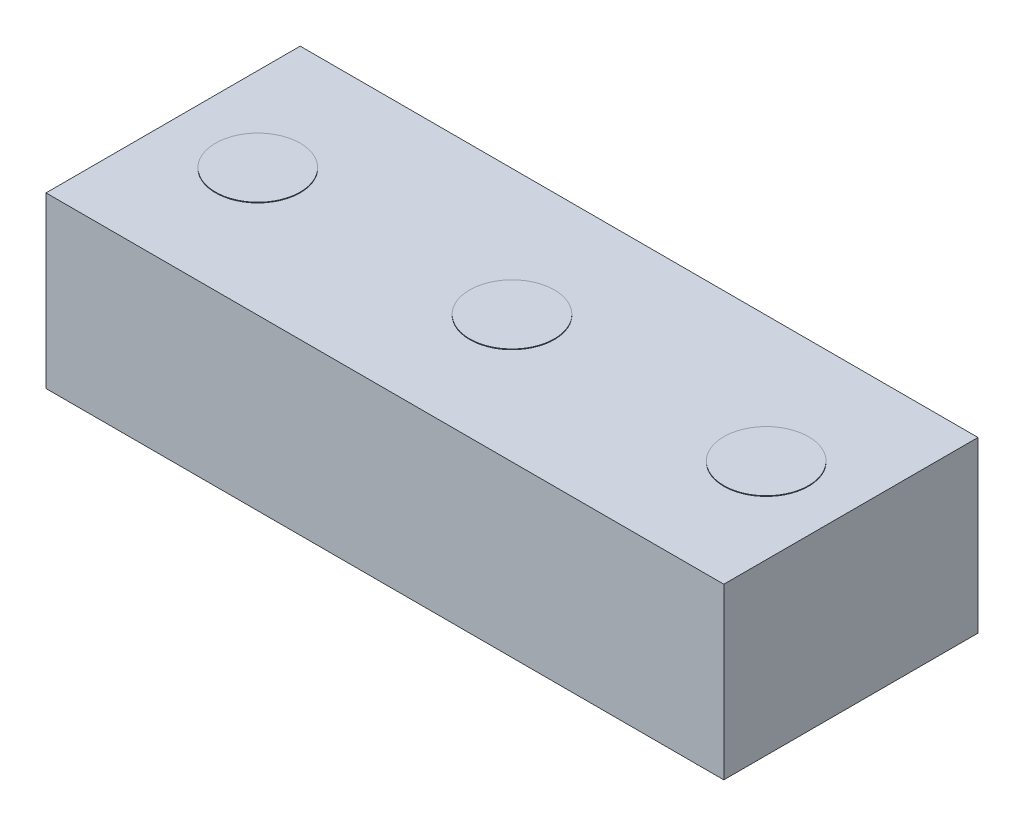
ISO-10303-21;
HEADER;
FILE_DESCRIPTION(('STEP AP214'),'2;1');
FILE_NAME('part.step','',(''),(''),'','','');
FILE_SCHEMA(('AUTOMOTIVE_DESIGN { 1 0 10303 214 1 1 1 1 }'));
ENDSEC;
DATA;
#1=APPLICATION_CONTEXT('core data for automotive mechanical design processes');
#2=APPLICATION_PROTOCOL_DEFINITION('international standard','automotive_design',2000,#1);
#3=PRODUCT_CONTEXT('',#1,'mechanical');
#4=PRODUCT('Part','Part','',(#3));
#5=PRODUCT_RELATED_PRODUCT_CATEGORY('part','',(#4));
#6=PRODUCT_DEFINITION_FORMATION('','',#4);
#7=PRODUCT_DEFINITION_CONTEXT('part definition',#1,'design');
#8=PRODUCT_DEFINITION('design','',#6,#7);
#9=PRODUCT_DEFINITION_SHAPE('','',#8);
#10=(LENGTH_UNIT() NAMED_UNIT(*) SI_UNIT(.MILLI.,.METRE.));
#11=(NAMED_UNIT(*) PLANE_ANGLE_UNIT() SI_UNIT($,.RADIAN.));
#12=(NAMED_UNIT(*) SI_UNIT($,.STERADIAN.) SOLID_ANGLE_UNIT());
#13=UNCERTAINTY_MEASURE_WITH_UNIT(LENGTH_MEASURE(1.E-05),#10,'distance_accuracy_value','');
#14=(GEOMETRIC_REPRESENTATION_CONTEXT(3) GLOBAL_UNCERTAINTY_ASSIGNED_CONTEXT((#13)) GLOBAL_UNIT_ASSIGNED_CONTEXT((#10,
#11,#12)) REPRESENTATION_CONTEXT('',''));
#15=CARTESIAN_POINT('',(0.,0.,0.));
#16=DIRECTION('',(0.,0.,1.));
#17=DIRECTION('',(1.,0.,0.));
#18=AXIS2_PLACEMENT_3D('',#15,#16,#17);
#19=CARTESIAN_POINT('',(150.,100.4,0.));
#20=DIRECTION('',(0.,-1.,0.));
#21=DIRECTION('',(0.,0.,-1.));
#22=AXIS2_PLACEMENT_3D('',#19,#20,#21);
#23=CYLINDRICAL_SURFACE('',#22,25.);
#24=CARTESIAN_POINT('',(150.,100.4,0.));
#25=DIRECTION('',(0.,1.,0.));
#26=DIRECTION('',(0.,0.,1.));
#27=AXIS2_PLACEMENT_3D('',#24,#25,#26);
#28=CIRCLE('',#27,25.);
#29=CARTESIAN_POINT('',(150.,100.4,25.));
#30=VERTEX_POINT('',#29);
#31=EDGE_CURVE('E90',#30,#30,#28,.T.);
#32=ORIENTED_EDGE('',*,*,#31,.F.);
#33=EDGE_LOOP('',(#32));
#34=FACE_BOUND('',#33,.T.);
#35=CARTESIAN_POINT('',(150.,100.,0.));
#36=DIRECTION('',(0.,1.,0.));
#37=DIRECTION('',(0.,0.,1.));
#38=AXIS2_PLACEMENT_3D('',#35,#36,#37);
#39=CIRCLE('',#38,25.);
#40=CARTESIAN_POINT('',(150.,100.,25.));
#41=VERTEX_POINT('',#40);
#42=EDGE_CURVE('E12',#41,#41,#39,.T.);
#43=ORIENTED_EDGE('',*,*,#42,.T.);
#44=EDGE_LOOP('',(#43));
#45=FACE_BOUND('',#44,.T.);
#46=ADVANCED_FACE('F86',(#34,#45),#23,.T.);
#47=CARTESIAN_POINT('',(150.,100.4,0.));
#48=DIRECTION('',(0.,1.,0.));
#49=DIRECTION('',(0.,0.,1.));
#50=AXIS2_PLACEMENT_3D('',#47,#48,#49);
#51=PLANE('',#50);
#52=ORIENTED_EDGE('',*,*,#31,.T.);
#53=EDGE_LOOP('',(#52));
#54=FACE_BOUND('',#53,.T.);
#55=ADVANCED_FACE('F88',(#54),#51,.T.);
#56=CARTESIAN_POINT('',(150.,100.,0.));
#57=DIRECTION('',(0.,1.,0.));
#58=DIRECTION('',(0.,0.,1.));
#59=AXIS2_PLACEMENT_3D('',#56,#57,#58);
#60=PLANE('',#59);
#61=ORIENTED_EDGE('',*,*,#42,.F.);
#62=EDGE_LOOP('',(#61));
#63=FACE_BOUND('',#62,.T.);
#64=ADVANCED_FACE('F106',(#63),#60,.F.);
#65=CLOSED_SHELL('',(#46,#55,#64));
#66=MANIFOLD_SOLID_BREP('B2',#65);
#67=CARTESIAN_POINT('',(-150.,100.4,0.));
#68=DIRECTION('',(0.,-1.,0.));
#69=DIRECTION('',(0.,0.,-1.));
#70=AXIS2_PLACEMENT_3D('',#67,#68,#69);
#71=CYLINDRICAL_SURFACE('',#70,25.);
#72=CARTESIAN_POINT('',(-150.,100.4,0.));
#73=DIRECTION('',(0.,1.,0.));
#74=DIRECTION('',(0.,0.,-1.));
#75=AXIS2_PLACEMENT_3D('',#72,#73,#74);
#76=CIRCLE('',#75,25.);
#77=CARTESIAN_POINT('',(-150.,100.4,-25.));
#78=VERTEX_POINT('',#77);
#79=EDGE_CURVE('E144',#78,#78,#76,.T.);
#80=ORIENTED_EDGE('',*,*,#79,.F.);
#81=EDGE_LOOP('',(#80));
#82=FACE_BOUND('',#81,.T.);
#83=CARTESIAN_POINT('',(-150.,100.,0.));
#84=DIRECTION('',(0.,1.,0.));
#85=DIRECTION('',(0.,0.,-1.));
#86=AXIS2_PLACEMENT_3D('',#83,#84,#85);
#87=CIRCLE('',#86,25.);
#88=CARTESIAN_POINT('',(-150.,100.,-25.));
#89=VERTEX_POINT('',#88);
#90=EDGE_CURVE('E85',#89,#89,#87,.T.);
#91=ORIENTED_EDGE('',*,*,#90,.T.);
#92=EDGE_LOOP('',(#91));
#93=FACE_BOUND('',#92,.T.);
#94=ADVANCED_FACE('F140',(#82,#93),#71,.T.);
#95=CARTESIAN_POINT('',(-150.,100.4,0.));
#96=DIRECTION('',(0.,-1.,0.));
#97=DIRECTION('',(0.,0.,-1.));
#98=AXIS2_PLACEMENT_3D('',#95,#96,#97);
#99=PLANE('',#98);
#100=ORIENTED_EDGE('',*,*,#79,.T.);
#101=EDGE_LOOP('',(#100));
#102=FACE_BOUND('',#101,.T.);
#103=ADVANCED_FACE('F142',(#102),#99,.F.);
#104=CARTESIAN_POINT('',(-150.,100.,0.));
#105=DIRECTION('',(0.,-1.,0.));
#106=DIRECTION('',(0.,0.,-1.));
#107=AXIS2_PLACEMENT_3D('',#104,#105,#106);
#108=PLANE('',#107);
#109=ORIENTED_EDGE('',*,*,#90,.F.);
#110=EDGE_LOOP('',(#109));
#111=FACE_BOUND('',#110,.T.);
#112=ADVANCED_FACE('F160',(#111),#108,.T.);
#113=CLOSED_SHELL('',(#94,#103,#112));
#114=MANIFOLD_SOLID_BREP('B7',#113);
#115=CARTESIAN_POINT('',(0.,100.4,0.));
#116=DIRECTION('',(0.,-1.,0.));
#117=DIRECTION('',(0.,0.,-1.));
#118=AXIS2_PLACEMENT_3D('',#115,#116,#117);
#119=CYLINDRICAL_SURFACE('',#118,25.);
#120=CARTESIAN_POINT('',(0.,100.4,0.));
#121=DIRECTION('',(0.,1.,0.));
#122=DIRECTION('',(0.,0.,1.));
#123=AXIS2_PLACEMENT_3D('',#120,#121,#122);
#124=CIRCLE('',#123,25.);
#125=CARTESIAN_POINT('',(0.,100.4,25.));
#126=VERTEX_POINT('',#125);
#127=EDGE_CURVE('E139',#126,#126,#124,.T.);
#128=ORIENTED_EDGE('',*,*,#127,.F.);
#129=EDGE_LOOP('',(#128));
#130=FACE_BOUND('',#129,.T.);
#131=CARTESIAN_POINT('',(0.,100.,0.));
#132=DIRECTION('',(0.,1.,0.));
#133=DIRECTION('',(0.,0.,1.));
#134=AXIS2_PLACEMENT_3D('',#131,#132,#133);
#135=CIRCLE('',#134,25.);
#136=CARTESIAN_POINT('',(0.,100.,25.));
#137=VERTEX_POINT('',#136);
#138=EDGE_CURVE('E198',#137,#137,#135,.T.);
#139=ORIENTED_EDGE('',*,*,#138,.T.);
#140=EDGE_LOOP('',(#139));
#141=FACE_BOUND('',#140,.T.);
#142=ADVANCED_FACE('F195',(#130,#141),#119,.T.);
#143=CARTESIAN_POINT('',(0.,100.4,0.));
#144=DIRECTION('',(0.,1.,0.));
#145=DIRECTION('',(0.,0.,1.));
#146=AXIS2_PLACEMENT_3D('',#143,#144,#145);
#147=PLANE('',#146);
#148=ORIENTED_EDGE('',*,*,#127,.T.);
#149=EDGE_LOOP('',(#148));
#150=FACE_BOUND('',#149,.T.);
#151=ADVANCED_FACE('F212',(#150),#147,.T.);
#152=CARTESIAN_POINT('',(0.,100.,0.));
#153=DIRECTION('',(0.,1.,0.));
#154=DIRECTION('',(0.,0.,1.));
#155=AXIS2_PLACEMENT_3D('',#152,#153,#154);
#156=PLANE('',#155);
#157=ORIENTED_EDGE('',*,*,#138,.F.);
#158=EDGE_LOOP('',(#157));
#159=FACE_BOUND('',#158,.T.);
#160=ADVANCED_FACE('F210',(#159),#156,.F.);
#161=CLOSED_SHELL('',(#142,#151,#160));
#162=MANIFOLD_SOLID_BREP('B80',#161);
#163=CARTESIAN_POINT('',(197.5,100.,0.));
#164=DIRECTION('',(-1.,0.,0.));
#165=DIRECTION('',(0.,0.,1.));
#166=AXIS2_PLACEMENT_3D('',#163,#164,#165);
#167=PLANE('',#166);
#168=DIRECTION('',(0.,-1.,0.));
#169=VECTOR('',#168,1.);
#170=CARTESIAN_POINT('',(197.5,100.,72.5));
#171=LINE('',#170,#169);
#172=CARTESIAN_POINT('',(197.5,97.5,72.5));
#173=VERTEX_POINT('',#172);
#174=CARTESIAN_POINT('',(197.5,0.,72.5));
#175=VERTEX_POINT('',#174);
#176=EDGE_CURVE('E263',#173,#175,#171,.T.);
#177=ORIENTED_EDGE('',*,*,#176,.F.);
#178=DIRECTION('',(0.,0.,-1.));
#179=VECTOR('',#178,1.);
#180=CARTESIAN_POINT('',(197.5,97.5,0.));
#181=LINE('',#180,#179);
#182=CARTESIAN_POINT('',(197.5,97.5,-72.5));
#183=VERTEX_POINT('',#182);
#184=EDGE_CURVE('E257',#173,#183,#181,.T.);
#185=ORIENTED_EDGE('',*,*,#184,.T.);
#186=DIRECTION('',(0.,-1.,0.));
#187=VECTOR('',#186,1.);
#188=CARTESIAN_POINT('',(197.5,100.,-72.5));
#189=LINE('',#188,#187);
#190=CARTESIAN_POINT('',(197.5,0.,-72.5));
#191=VERTEX_POINT('',#190);
#192=EDGE_CURVE('E328',#183,#191,#189,.T.);
#193=ORIENTED_EDGE('',*,*,#192,.T.);
#194=DIRECTION('',(0.,0.,-1.));
#195=VECTOR('',#194,1.);
#196=CARTESIAN_POINT('',(197.5,0.,0.));
#197=LINE('',#196,#195);
#198=EDGE_CURVE('E531',#175,#191,#197,.T.);
#199=ORIENTED_EDGE('',*,*,#198,.F.);
#200=EDGE_LOOP('',(#177,#185,#193,#199));
#201=FACE_BOUND('',#200,.T.);
#202=ADVANCED_FACE('F241',(#201),#167,.T.);
#203=CARTESIAN_POINT('',(0.,100.,-72.5));
#204=DIRECTION('',(0.,0.,1.));
#205=DIRECTION('',(1.,0.,0.));
#206=AXIS2_PLACEMENT_3D('',#203,#204,#205);
#207=PLANE('',#206);
#208=ORIENTED_EDGE('',*,*,#192,.F.);
#209=DIRECTION('',(-1.,0.,0.));
#210=VECTOR('',#209,1.);
#211=CARTESIAN_POINT('',(0.,97.5,-72.5));
#212=LINE('',#211,#210);
#213=CARTESIAN_POINT('',(-197.5,97.5,-72.5));
#214=VERTEX_POINT('',#213);
#215=EDGE_CURVE('E316',#183,#214,#212,.T.);
#216=ORIENTED_EDGE('',*,*,#215,.T.);
#217=DIRECTION('',(0.,-1.,0.));
#218=VECTOR('',#217,1.);
#219=CARTESIAN_POINT('',(-197.5,100.,-72.5));
#220=LINE('',#219,#218);
#221=CARTESIAN_POINT('',(-197.5,0.,-72.5));
#222=VERTEX_POINT('',#221);
#223=EDGE_CURVE('E314',#214,#222,#220,.T.);
#224=ORIENTED_EDGE('',*,*,#223,.T.);
#225=DIRECTION('',(-1.,0.,0.));
#226=VECTOR('',#225,1.);
#227=CARTESIAN_POINT('',(0.,0.,-72.5));
#228=LINE('',#227,#226);
#229=EDGE_CURVE('E535',#191,#222,#228,.T.);
#230=ORIENTED_EDGE('',*,*,#229,.F.);
#231=EDGE_LOOP('',(#208,#216,#224,#230));
#232=FACE_BOUND('',#231,.T.);
#233=ADVANCED_FACE('F407',(#232),#207,.T.);
#234=CARTESIAN_POINT('',(-197.5,100.,0.));
#235=DIRECTION('',(1.,0.,0.));
#236=DIRECTION('',(0.,0.,-1.));
#237=AXIS2_PLACEMENT_3D('',#234,#235,#236);
#238=PLANE('',#237);
#239=ORIENTED_EDGE('',*,*,#223,.F.);
#240=DIRECTION('',(0.,0.,1.));
#241=VECTOR('',#240,1.);
#242=CARTESIAN_POINT('',(-197.5,97.5,0.));
#243=LINE('',#242,#241);
#244=CARTESIAN_POINT('',(-197.5,97.5,72.5));
#245=VERTEX_POINT('',#244);
#246=EDGE_CURVE('E306',#214,#245,#243,.T.);
#247=ORIENTED_EDGE('',*,*,#246,.T.);
#248=DIRECTION('',(0.,-1.,0.));
#249=VECTOR('',#248,1.);
#250=CARTESIAN_POINT('',(-197.5,100.,72.5));
#251=LINE('',#250,#249);
#252=CARTESIAN_POINT('',(-197.5,0.,72.5));
#253=VERTEX_POINT('',#252);
#254=EDGE_CURVE('E313',#245,#253,#251,.T.);
#255=ORIENTED_EDGE('',*,*,#254,.T.);
#256=DIRECTION('',(0.,0.,1.));
#257=VECTOR('',#256,1.);
#258=CARTESIAN_POINT('',(-197.5,0.,0.));
#259=LINE('',#258,#257);
#260=EDGE_CURVE('E537',#222,#253,#259,.T.);
#261=ORIENTED_EDGE('',*,*,#260,.F.);
#262=EDGE_LOOP('',(#239,#247,#255,#261));
#263=FACE_BOUND('',#262,.T.);
#264=ADVANCED_FACE('F311',(#263),#238,.T.);
#265=CARTESIAN_POINT('',(0.,100.,72.5));
#266=DIRECTION('',(0.,0.,-1.));
#267=DIRECTION('',(-1.,0.,0.));
#268=AXIS2_PLACEMENT_3D('',#265,#266,#267);
#269=PLANE('',#268);
#270=ORIENTED_EDGE('',*,*,#254,.F.);
#271=DIRECTION('',(1.,0.,0.));
#272=VECTOR('',#271,1.);
#273=CARTESIAN_POINT('',(0.,97.5,72.5));
#274=LINE('',#273,#272);
#275=EDGE_CURVE('E193',#245,#173,#274,.T.);
#276=ORIENTED_EDGE('',*,*,#275,.T.);
#277=ORIENTED_EDGE('',*,*,#176,.T.);
#278=DIRECTION('',(1.,0.,0.));
#279=VECTOR('',#278,1.);
#280=CARTESIAN_POINT('',(0.,0.,72.5));
#281=LINE('',#280,#279);
#282=EDGE_CURVE('E320',#253,#175,#281,.T.);
#283=ORIENTED_EDGE('',*,*,#282,.F.);
#284=EDGE_LOOP('',(#270,#276,#277,#283));
#285=FACE_BOUND('',#284,.T.);
#286=ADVANCED_FACE('F318',(#285),#269,.T.);
#287=CARTESIAN_POINT('',(0.,100.,0.));
#288=DIRECTION('',(0.,1.,0.));
#289=DIRECTION('',(0.,0.,1.));
#290=AXIS2_PLACEMENT_3D('',#287,#288,#289);
#291=PLANE('',#290);
#292=DIRECTION('',(0.,0.,-1.));
#293=VECTOR('',#292,1.);
#294=CARTESIAN_POINT('',(200.,100.,75.));
#295=LINE('',#294,#293);
#296=CARTESIAN_POINT('',(200.,100.,75.));
#297=VERTEX_POINT('',#296);
#298=CARTESIAN_POINT('',(200.,100.,-75.));
#299=VERTEX_POINT('',#298);
#300=EDGE_CURVE('E337',#297,#299,#295,.T.);
#301=ORIENTED_EDGE('',*,*,#300,.T.);
#302=DIRECTION('',(-1.,0.,0.));
#303=VECTOR('',#302,1.);
#304=CARTESIAN_POINT('',(-200.,100.,-75.));
#305=LINE('',#304,#303);
#306=CARTESIAN_POINT('',(-200.,100.,-75.));
#307=VERTEX_POINT('',#306);
#308=EDGE_CURVE('E341',#299,#307,#305,.T.);
#309=ORIENTED_EDGE('',*,*,#308,.T.);
#310=DIRECTION('',(0.,0.,1.));
#311=VECTOR('',#310,1.);
#312=CARTESIAN_POINT('',(-200.,100.,75.));
#313=LINE('',#312,#311);
#314=CARTESIAN_POINT('',(-200.,100.,75.));
#315=VERTEX_POINT('',#314);
#316=EDGE_CURVE('E345',#307,#315,#313,.T.);
#317=ORIENTED_EDGE('',*,*,#316,.T.);
#318=DIRECTION('',(1.,0.,0.));
#319=VECTOR('',#318,1.);
#320=CARTESIAN_POINT('',(-200.,100.,75.));
#321=LINE('',#320,#319);
#322=EDGE_CURVE('E348',#315,#297,#321,.T.);
#323=ORIENTED_EDGE('',*,*,#322,.T.);
#324=EDGE_LOOP('',(#301,#309,#317,#323));
#325=FACE_BOUND('',#324,.T.);
#326=ADVANCED_FACE('F395',(#325),#291,.T.);
#327=CARTESIAN_POINT('',(0.,0.,0.));
#328=DIRECTION('',(0.,1.,0.));
#329=DIRECTION('',(0.,0.,1.));
#330=AXIS2_PLACEMENT_3D('',#327,#328,#329);
#331=PLANE('',#330);
#332=DIRECTION('',(0.,0.,-1.));
#333=VECTOR('',#332,1.);
#334=CARTESIAN_POINT('',(200.,0.,75.));
#335=LINE('',#334,#333);
#336=CARTESIAN_POINT('',(200.,0.,75.));
#337=VERTEX_POINT('',#336);
#338=CARTESIAN_POINT('',(200.,0.,-75.));
#339=VERTEX_POINT('',#338);
#340=EDGE_CURVE('E336',#337,#339,#335,.T.);
#341=ORIENTED_EDGE('',*,*,#340,.F.);
#342=DIRECTION('',(1.,0.,0.));
#343=VECTOR('',#342,1.);
#344=CARTESIAN_POINT('',(-200.,0.,75.));
#345=LINE('',#344,#343);
#346=CARTESIAN_POINT('',(-200.,0.,75.));
#347=VERTEX_POINT('',#346);
#348=EDGE_CURVE('E342',#347,#337,#345,.T.);
#349=ORIENTED_EDGE('',*,*,#348,.F.);
#350=DIRECTION('',(0.,0.,1.));
#351=VECTOR('',#350,1.);
#352=CARTESIAN_POINT('',(-200.,0.,75.));
#353=LINE('',#352,#351);
#354=CARTESIAN_POINT('',(-200.,0.,-75.));
#355=VERTEX_POINT('',#354);
#356=EDGE_CURVE('E358',#355,#347,#353,.T.);
#357=ORIENTED_EDGE('',*,*,#356,.F.);
#358=DIRECTION('',(-1.,0.,0.));
#359=VECTOR('',#358,1.);
#360=CARTESIAN_POINT('',(-200.,0.,-75.));
#361=LINE('',#360,#359);
#362=EDGE_CURVE('E354',#339,#355,#361,.T.);
#363=ORIENTED_EDGE('',*,*,#362,.F.);
#364=EDGE_LOOP('',(#341,#349,#357,#363));
#365=FACE_BOUND('',#364,.T.);
#366=ORIENTED_EDGE('',*,*,#198,.T.);
#367=ORIENTED_EDGE('',*,*,#229,.T.);
#368=ORIENTED_EDGE('',*,*,#260,.T.);
#369=ORIENTED_EDGE('',*,*,#282,.T.);
#370=EDGE_LOOP('',(#366,#367,#368,#369));
#371=FACE_BOUND('',#370,.T.);
#372=ADVANCED_FACE('F383',(#365,#371),#331,.F.);
#373=CARTESIAN_POINT('',(200.,100.,75.));
#374=DIRECTION('',(-1.,0.,0.));
#375=DIRECTION('',(0.,0.,1.));
#376=AXIS2_PLACEMENT_3D('',#373,#374,#375);
#377=PLANE('',#376);
#378=DIRECTION('',(0.,-1.,0.));
#379=VECTOR('',#378,1.);
#380=CARTESIAN_POINT('',(200.,100.,75.));
#381=LINE('',#380,#379);
#382=EDGE_CURVE('E351',#297,#337,#381,.T.);
#383=ORIENTED_EDGE('',*,*,#382,.T.);
#384=ORIENTED_EDGE('',*,*,#340,.T.);
#385=DIRECTION('',(0.,-1.,0.));
#386=VECTOR('',#385,1.);
#387=CARTESIAN_POINT('',(200.,100.,-75.));
#388=LINE('',#387,#386);
#389=EDGE_CURVE('E250',#299,#339,#388,.T.);
#390=ORIENTED_EDGE('',*,*,#389,.F.);
#391=ORIENTED_EDGE('',*,*,#300,.F.);
#392=EDGE_LOOP('',(#383,#384,#390,#391));
#393=FACE_BOUND('',#392,.T.);
#394=ADVANCED_FACE('F243',(#393),#377,.F.);
#395=CARTESIAN_POINT('',(-200.,100.,-75.));
#396=DIRECTION('',(0.,0.,1.));
#397=DIRECTION('',(1.,0.,0.));
#398=AXIS2_PLACEMENT_3D('',#395,#396,#397);
#399=PLANE('',#398);
#400=ORIENTED_EDGE('',*,*,#389,.T.);
#401=ORIENTED_EDGE('',*,*,#362,.T.);
#402=DIRECTION('',(0.,-1.,0.));
#403=VECTOR('',#402,1.);
#404=CARTESIAN_POINT('',(-200.,100.,-75.));
#405=LINE('',#404,#403);
#406=EDGE_CURVE('E369',#307,#355,#405,.T.);
#407=ORIENTED_EDGE('',*,*,#406,.F.);
#408=ORIENTED_EDGE('',*,*,#308,.F.);
#409=EDGE_LOOP('',(#400,#401,#407,#408));
#410=FACE_BOUND('',#409,.T.);
#411=ADVANCED_FACE('F376',(#410),#399,.F.);
#412=CARTESIAN_POINT('',(-200.,100.,75.));
#413=DIRECTION('',(1.,0.,0.));
#414=DIRECTION('',(0.,0.,-1.));
#415=AXIS2_PLACEMENT_3D('',#412,#413,#414);
#416=PLANE('',#415);
#417=ORIENTED_EDGE('',*,*,#406,.T.);
#418=ORIENTED_EDGE('',*,*,#356,.T.);
#419=DIRECTION('',(0.,-1.,0.));
#420=VECTOR('',#419,1.);
#421=CARTESIAN_POINT('',(-200.,100.,75.));
#422=LINE('',#421,#420);
#423=EDGE_CURVE('E366',#315,#347,#422,.T.);
#424=ORIENTED_EDGE('',*,*,#423,.F.);
#425=ORIENTED_EDGE('',*,*,#316,.F.);
#426=EDGE_LOOP('',(#417,#418,#424,#425));
#427=FACE_BOUND('',#426,.T.);
#428=ADVANCED_FACE('F393',(#427),#416,.F.);
#429=CARTESIAN_POINT('',(-200.,100.,75.));
#430=DIRECTION('',(0.,0.,-1.));
#431=DIRECTION('',(-1.,0.,0.));
#432=AXIS2_PLACEMENT_3D('',#429,#430,#431);
#433=PLANE('',#432);
#434=ORIENTED_EDGE('',*,*,#423,.T.);
#435=ORIENTED_EDGE('',*,*,#348,.T.);
#436=ORIENTED_EDGE('',*,*,#382,.F.);
#437=ORIENTED_EDGE('',*,*,#322,.F.);
#438=EDGE_LOOP('',(#434,#435,#436,#437));
#439=FACE_BOUND('',#438,.T.);
#440=ADVANCED_FACE('F389',(#439),#433,.F.);
#441=CARTESIAN_POINT('',(0.,97.5,0.));
#442=DIRECTION('',(0.,1.,0.));
#443=DIRECTION('',(0.,0.,1.));
#444=AXIS2_PLACEMENT_3D('',#441,#442,#443);
#445=PLANE('',#444);
#446=ORIENTED_EDGE('',*,*,#184,.F.);
#447=ORIENTED_EDGE('',*,*,#275,.F.);
#448=ORIENTED_EDGE('',*,*,#246,.F.);
#449=ORIENTED_EDGE('',*,*,#215,.F.);
#450=EDGE_LOOP('',(#446,#447,#448,#449));
#451=FACE_BOUND('',#450,.T.);
#452=ADVANCED_FACE('F305',(#451),#445,.F.);
#453=CLOSED_SHELL('',(#202,#233,#264,#286,#326,#372,#394,#411,#428,#440,#452));
#454=MANIFOLD_SOLID_BREP('B134',#453);
#455=ADVANCED_BREP_SHAPE_REPRESENTATION('',(#18,#66,#114,#162,#454),#14);
#456=SHAPE_DEFINITION_REPRESENTATION(#9,#455);
ENDSEC;
END-ISO-10303-21;
